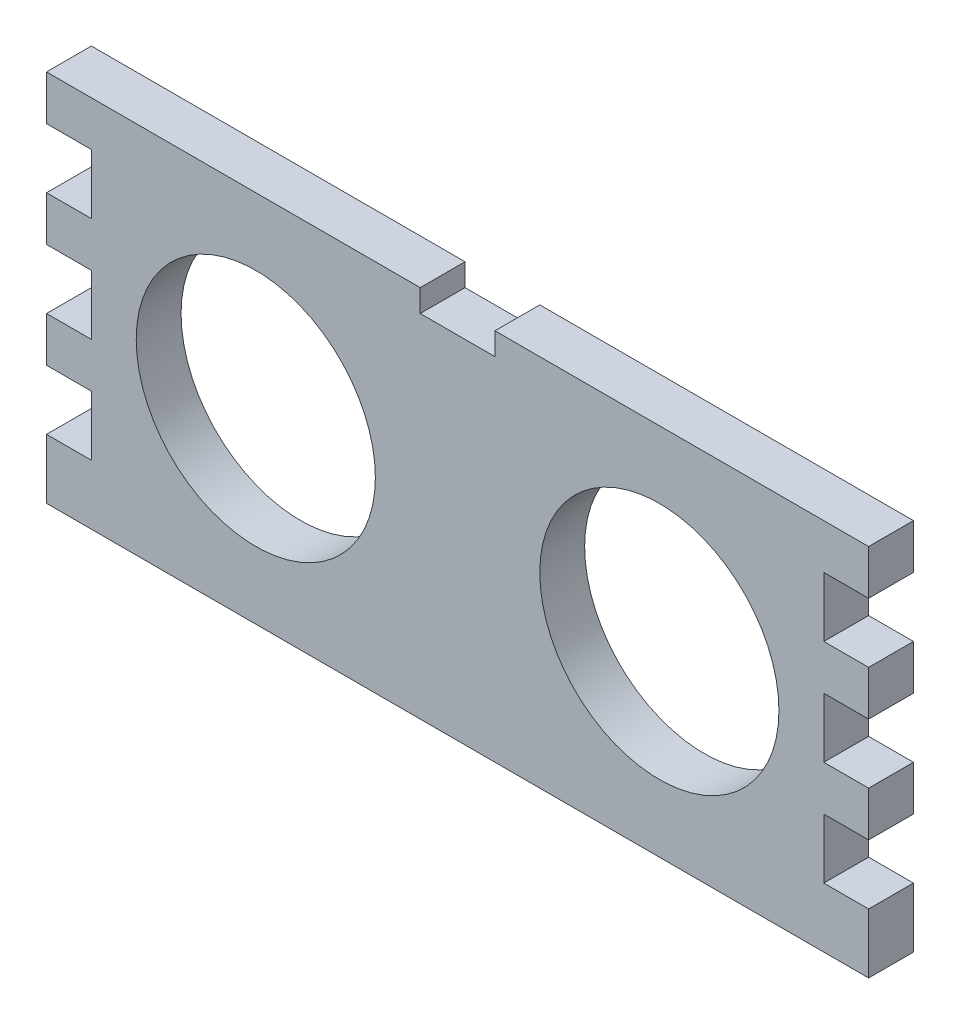
ISO-10303-21;
HEADER;
FILE_DESCRIPTION(('STEP AP214'),'2;1');
FILE_NAME('part.step','',(''),(''),'','','');
FILE_SCHEMA(('AUTOMOTIVE_DESIGN { 1 0 10303 214 1 1 1 1 }'));
ENDSEC;
DATA;
#1=APPLICATION_CONTEXT('core data for automotive mechanical design processes');
#2=APPLICATION_PROTOCOL_DEFINITION('international standard','automotive_design',2000,#1);
#3=PRODUCT_CONTEXT('',#1,'mechanical');
#4=PRODUCT('Part','Part','',(#3));
#5=PRODUCT_RELATED_PRODUCT_CATEGORY('part','',(#4));
#6=PRODUCT_DEFINITION_FORMATION('','',#4);
#7=PRODUCT_DEFINITION_CONTEXT('part definition',#1,'design');
#8=PRODUCT_DEFINITION('design','',#6,#7);
#9=PRODUCT_DEFINITION_SHAPE('','',#8);
#10=(LENGTH_UNIT() NAMED_UNIT(*) SI_UNIT(.MILLI.,.METRE.));
#11=(NAMED_UNIT(*) PLANE_ANGLE_UNIT() SI_UNIT($,.RADIAN.));
#12=(NAMED_UNIT(*) SI_UNIT($,.STERADIAN.) SOLID_ANGLE_UNIT());
#13=UNCERTAINTY_MEASURE_WITH_UNIT(LENGTH_MEASURE(1.E-05),#10,'distance_accuracy_value','');
#14=(GEOMETRIC_REPRESENTATION_CONTEXT(3) GLOBAL_UNCERTAINTY_ASSIGNED_CONTEXT((#13)) GLOBAL_UNIT_ASSIGNED_CONTEXT((#10,
#11,#12)) REPRESENTATION_CONTEXT('',''));
#15=CARTESIAN_POINT('',(0.,0.,0.));
#16=DIRECTION('',(0.,0.,1.));
#17=DIRECTION('',(1.,0.,0.));
#18=AXIS2_PLACEMENT_3D('',#15,#16,#17);
#19=CARTESIAN_POINT('',(-27.5,12.5,3.));
#20=DIRECTION('',(0.,-1.,0.));
#21=DIRECTION('',(0.,0.,-1.));
#22=AXIS2_PLACEMENT_3D('',#19,#20,#21);
#23=PLANE('',#22);
#24=DIRECTION('',(-1.,0.,0.));
#25=VECTOR('',#24,1.);
#26=CARTESIAN_POINT('',(-27.5,12.5,3.));
#27=LINE('',#26,#25);
#28=CARTESIAN_POINT('',(-2.5,12.5,3.));
#29=VERTEX_POINT('',#28);
#30=CARTESIAN_POINT('',(-27.5,12.5,3.));
#31=VERTEX_POINT('',#30);
#32=EDGE_CURVE('E444',#29,#31,#27,.T.);
#33=ORIENTED_EDGE('',*,*,#32,.F.);
#34=DIRECTION('',(0.,0.,1.));
#35=VECTOR('',#34,1.);
#36=CARTESIAN_POINT('',(-2.5,12.5,-7.));
#37=LINE('',#36,#35);
#38=CARTESIAN_POINT('',(-2.5,12.5,0.));
#39=VERTEX_POINT('',#38);
#40=EDGE_CURVE('E260',#39,#29,#37,.T.);
#41=ORIENTED_EDGE('',*,*,#40,.F.);
#42=DIRECTION('',(-1.,0.,0.));
#43=VECTOR('',#42,1.);
#44=CARTESIAN_POINT('',(-27.5,12.5,0.));
#45=LINE('',#44,#43);
#46=CARTESIAN_POINT('',(-27.5,12.5,0.));
#47=VERTEX_POINT('',#46);
#48=EDGE_CURVE('E460',#39,#47,#45,.T.);
#49=ORIENTED_EDGE('',*,*,#48,.T.);
#50=DIRECTION('',(0.,0.,-1.));
#51=VECTOR('',#50,1.);
#52=CARTESIAN_POINT('',(-27.5,12.5,3.));
#53=LINE('',#52,#51);
#54=EDGE_CURVE('E477',#31,#47,#53,.T.);
#55=ORIENTED_EDGE('',*,*,#54,.F.);
#56=EDGE_LOOP('',(#33,#41,#49,#55));
#57=FACE_BOUND('',#56,.T.);
#58=ADVANCED_FACE('F38',(#57),#23,.F.);
#59=CARTESIAN_POINT('',(27.5,-12.5,3.));
#60=DIRECTION('',(-1.,0.,0.));
#61=DIRECTION('',(0.,0.,1.));
#62=AXIS2_PLACEMENT_3D('',#59,#60,#61);
#63=PLANE('',#62);
#64=DIRECTION('',(0.,1.,0.));
#65=VECTOR('',#64,1.);
#66=CARTESIAN_POINT('',(27.5,-12.5,0.));
#67=LINE('',#66,#65);
#68=CARTESIAN_POINT('',(27.5,2.5,0.));
#69=VERTEX_POINT('',#68);
#70=CARTESIAN_POINT('',(27.5,5.5,0.));
#71=VERTEX_POINT('',#70);
#72=EDGE_CURVE('E572',#69,#71,#67,.T.);
#73=ORIENTED_EDGE('',*,*,#72,.T.);
#74=DIRECTION('',(0.,0.,1.));
#75=VECTOR('',#74,1.);
#76=CARTESIAN_POINT('',(27.5,5.5,0.));
#77=LINE('',#76,#75);
#78=CARTESIAN_POINT('',(27.5,5.5,3.));
#79=VERTEX_POINT('',#78);
#80=EDGE_CURVE('E292',#71,#79,#77,.T.);
#81=ORIENTED_EDGE('',*,*,#80,.T.);
#82=DIRECTION('',(0.,1.,0.));
#83=VECTOR('',#82,1.);
#84=CARTESIAN_POINT('',(27.5,-12.5,3.));
#85=LINE('',#84,#83);
#86=CARTESIAN_POINT('',(27.5,2.5,3.));
#87=VERTEX_POINT('',#86);
#88=EDGE_CURVE('E557',#87,#79,#85,.T.);
#89=ORIENTED_EDGE('',*,*,#88,.F.);
#90=DIRECTION('',(0.,0.,1.));
#91=VECTOR('',#90,1.);
#92=CARTESIAN_POINT('',(27.5,2.5,0.));
#93=LINE('',#92,#91);
#94=EDGE_CURVE('E301',#69,#87,#93,.T.);
#95=ORIENTED_EDGE('',*,*,#94,.F.);
#96=EDGE_LOOP('',(#73,#81,#89,#95));
#97=FACE_BOUND('',#96,.T.);
#98=ADVANCED_FACE('F586',(#97),#63,.F.);
#99=CARTESIAN_POINT('',(27.5,-4.5,0.));
#100=VERTEX_POINT('',#99);
#101=CARTESIAN_POINT('',(27.5,-1.5,0.));
#102=VERTEX_POINT('',#101);
#103=EDGE_CURVE('E461',#100,#102,#67,.T.);
#104=ORIENTED_EDGE('',*,*,#103,.T.);
#105=DIRECTION('',(0.,0.,1.));
#106=VECTOR('',#105,1.);
#107=CARTESIAN_POINT('',(27.5,-1.5,0.));
#108=LINE('',#107,#106);
#109=CARTESIAN_POINT('',(27.5,-1.5,3.));
#110=VERTEX_POINT('',#109);
#111=EDGE_CURVE('E308',#102,#110,#108,.T.);
#112=ORIENTED_EDGE('',*,*,#111,.T.);
#113=CARTESIAN_POINT('',(27.5,-4.5,3.));
#114=VERTEX_POINT('',#113);
#115=EDGE_CURVE('E445',#114,#110,#85,.T.);
#116=ORIENTED_EDGE('',*,*,#115,.F.);
#117=DIRECTION('',(0.,0.,1.));
#118=VECTOR('',#117,1.);
#119=CARTESIAN_POINT('',(27.5,-4.5,0.));
#120=LINE('',#119,#118);
#121=EDGE_CURVE('E327',#100,#114,#120,.T.);
#122=ORIENTED_EDGE('',*,*,#121,.F.);
#123=EDGE_LOOP('',(#104,#112,#116,#122));
#124=FACE_BOUND('',#123,.T.);
#125=ADVANCED_FACE('F555',(#124),#63,.F.);
#126=CARTESIAN_POINT('',(27.5,-12.5,0.));
#127=VERTEX_POINT('',#126);
#128=CARTESIAN_POINT('',(27.5,-8.5,0.));
#129=VERTEX_POINT('',#128);
#130=EDGE_CURVE('E457',#127,#129,#67,.T.);
#131=ORIENTED_EDGE('',*,*,#130,.T.);
#132=DIRECTION('',(0.,0.,1.));
#133=VECTOR('',#132,1.);
#134=CARTESIAN_POINT('',(27.5,-8.5,0.));
#135=LINE('',#134,#133);
#136=CARTESIAN_POINT('',(27.5,-8.5,3.));
#137=VERTEX_POINT('',#136);
#138=EDGE_CURVE('E270',#129,#137,#135,.T.);
#139=ORIENTED_EDGE('',*,*,#138,.T.);
#140=CARTESIAN_POINT('',(27.5,-12.5,3.));
#141=VERTEX_POINT('',#140);
#142=EDGE_CURVE('E441',#141,#137,#85,.T.);
#143=ORIENTED_EDGE('',*,*,#142,.F.);
#144=DIRECTION('',(0.,0.,-1.));
#145=VECTOR('',#144,1.);
#146=CARTESIAN_POINT('',(27.5,-12.5,3.));
#147=LINE('',#146,#145);
#148=EDGE_CURVE('E456',#141,#127,#147,.T.);
#149=ORIENTED_EDGE('',*,*,#148,.T.);
#150=EDGE_LOOP('',(#131,#139,#143,#149));
#151=FACE_BOUND('',#150,.T.);
#152=ADVANCED_FACE('F537',(#151),#63,.F.);
#153=CARTESIAN_POINT('',(-27.5,-12.5,3.));
#154=DIRECTION('',(1.,0.,0.));
#155=DIRECTION('',(0.,0.,-1.));
#156=AXIS2_PLACEMENT_3D('',#153,#154,#155);
#157=PLANE('',#156);
#158=DIRECTION('',(0.,-1.,0.));
#159=VECTOR('',#158,1.);
#160=CARTESIAN_POINT('',(-27.5,-12.5,0.));
#161=LINE('',#160,#159);
#162=CARTESIAN_POINT('',(-27.5,9.5,0.));
#163=VERTEX_POINT('',#162);
#164=EDGE_CURVE('E466',#47,#163,#161,.T.);
#165=ORIENTED_EDGE('',*,*,#164,.T.);
#166=DIRECTION('',(0.,0.,1.));
#167=VECTOR('',#166,1.);
#168=CARTESIAN_POINT('',(-27.5,9.5,0.));
#169=LINE('',#168,#167);
#170=CARTESIAN_POINT('',(-27.5,9.5,3.));
#171=VERTEX_POINT('',#170);
#172=EDGE_CURVE('E370',#163,#171,#169,.T.);
#173=ORIENTED_EDGE('',*,*,#172,.T.);
#174=DIRECTION('',(0.,-1.,0.));
#175=VECTOR('',#174,1.);
#176=CARTESIAN_POINT('',(-27.5,-12.5,3.));
#177=LINE('',#176,#175);
#178=EDGE_CURVE('E450',#31,#171,#177,.T.);
#179=ORIENTED_EDGE('',*,*,#178,.F.);
#180=ORIENTED_EDGE('',*,*,#54,.T.);
#181=EDGE_LOOP('',(#165,#173,#179,#180));
#182=FACE_BOUND('',#181,.T.);
#183=ADVANCED_FACE('F498',(#182),#157,.F.);
#184=CARTESIAN_POINT('',(-27.5,5.5,3.));
#185=VERTEX_POINT('',#184);
#186=CARTESIAN_POINT('',(-27.5,2.5,3.));
#187=VERTEX_POINT('',#186);
#188=EDGE_CURVE('E454',#185,#187,#177,.T.);
#189=ORIENTED_EDGE('',*,*,#188,.F.);
#190=DIRECTION('',(0.,0.,1.));
#191=VECTOR('',#190,1.);
#192=CARTESIAN_POINT('',(-27.5,5.5,0.));
#193=LINE('',#192,#191);
#194=CARTESIAN_POINT('',(-27.5,5.5,0.));
#195=VERTEX_POINT('',#194);
#196=EDGE_CURVE('E361',#195,#185,#193,.T.);
#197=ORIENTED_EDGE('',*,*,#196,.F.);
#198=CARTESIAN_POINT('',(-27.5,2.5,0.));
#199=VERTEX_POINT('',#198);
#200=EDGE_CURVE('E470',#195,#199,#161,.T.);
#201=ORIENTED_EDGE('',*,*,#200,.T.);
#202=DIRECTION('',(0.,0.,1.));
#203=VECTOR('',#202,1.);
#204=CARTESIAN_POINT('',(-27.5,2.5,0.));
#205=LINE('',#204,#203);
#206=EDGE_CURVE('E386',#199,#187,#205,.T.);
#207=ORIENTED_EDGE('',*,*,#206,.T.);
#208=EDGE_LOOP('',(#189,#197,#201,#207));
#209=FACE_BOUND('',#208,.T.);
#210=ADVANCED_FACE('F514',(#209),#157,.F.);
#211=CARTESIAN_POINT('',(-27.5,-1.5,3.));
#212=VERTEX_POINT('',#211);
#213=CARTESIAN_POINT('',(-27.5,-4.5,3.));
#214=VERTEX_POINT('',#213);
#215=EDGE_CURVE('E516',#212,#214,#177,.T.);
#216=ORIENTED_EDGE('',*,*,#215,.F.);
#217=DIRECTION('',(0.,0.,1.));
#218=VECTOR('',#217,1.);
#219=CARTESIAN_POINT('',(-27.5,-1.5,0.));
#220=LINE('',#219,#218);
#221=CARTESIAN_POINT('',(-27.5,-1.5,0.));
#222=VERTEX_POINT('',#221);
#223=EDGE_CURVE('E379',#222,#212,#220,.T.);
#224=ORIENTED_EDGE('',*,*,#223,.F.);
#225=CARTESIAN_POINT('',(-27.5,-4.5,0.));
#226=VERTEX_POINT('',#225);
#227=EDGE_CURVE('E903',#222,#226,#161,.T.);
#228=ORIENTED_EDGE('',*,*,#227,.T.);
#229=DIRECTION('',(0.,0.,1.));
#230=VECTOR('',#229,1.);
#231=CARTESIAN_POINT('',(-27.5,-4.5,0.));
#232=LINE('',#231,#230);
#233=EDGE_CURVE('E295',#226,#214,#232,.T.);
#234=ORIENTED_EDGE('',*,*,#233,.T.);
#235=EDGE_LOOP('',(#216,#224,#228,#234));
#236=FACE_BOUND('',#235,.T.);
#237=ADVANCED_FACE('F612',(#236),#157,.F.);
#238=CARTESIAN_POINT('',(27.5,9.5,3.));
#239=VERTEX_POINT('',#238);
#240=CARTESIAN_POINT('',(27.5,12.5,3.));
#241=VERTEX_POINT('',#240);
#242=EDGE_CURVE('E446',#239,#241,#85,.T.);
#243=ORIENTED_EDGE('',*,*,#242,.F.);
#244=DIRECTION('',(0.,0.,1.));
#245=VECTOR('',#244,1.);
#246=CARTESIAN_POINT('',(27.5,9.5,0.));
#247=LINE('',#246,#245);
#248=CARTESIAN_POINT('',(27.5,9.5,0.));
#249=VERTEX_POINT('',#248);
#250=EDGE_CURVE('E283',#249,#239,#247,.T.);
#251=ORIENTED_EDGE('',*,*,#250,.F.);
#252=CARTESIAN_POINT('',(27.5,12.5,0.));
#253=VERTEX_POINT('',#252);
#254=EDGE_CURVE('E432',#249,#253,#67,.T.);
#255=ORIENTED_EDGE('',*,*,#254,.T.);
#256=DIRECTION('',(0.,0.,-1.));
#257=VECTOR('',#256,1.);
#258=CARTESIAN_POINT('',(27.5,12.5,3.));
#259=LINE('',#258,#257);
#260=EDGE_CURVE('E480',#241,#253,#259,.T.);
#261=ORIENTED_EDGE('',*,*,#260,.F.);
#262=EDGE_LOOP('',(#243,#251,#255,#261));
#263=FACE_BOUND('',#262,.T.);
#264=ADVANCED_FACE('F40',(#263),#63,.F.);
#265=CARTESIAN_POINT('',(2.5,12.5,0.));
#266=VERTEX_POINT('',#265);
#267=EDGE_CURVE('E462',#253,#266,#45,.T.);
#268=ORIENTED_EDGE('',*,*,#267,.T.);
#269=DIRECTION('',(0.,0.,1.));
#270=VECTOR('',#269,1.);
#271=CARTESIAN_POINT('',(2.5,12.5,-7.));
#272=LINE('',#271,#270);
#273=CARTESIAN_POINT('',(2.5,12.5,3.));
#274=VERTEX_POINT('',#273);
#275=EDGE_CURVE('E271',#266,#274,#272,.T.);
#276=ORIENTED_EDGE('',*,*,#275,.T.);
#277=EDGE_CURVE('E447',#241,#274,#27,.T.);
#278=ORIENTED_EDGE('',*,*,#277,.F.);
#279=ORIENTED_EDGE('',*,*,#260,.T.);
#280=EDGE_LOOP('',(#268,#276,#278,#279));
#281=FACE_BOUND('',#280,.T.);
#282=ADVANCED_FACE('F570',(#281),#23,.F.);
#283=CARTESIAN_POINT('',(-27.5,-8.5,3.));
#284=VERTEX_POINT('',#283);
#285=CARTESIAN_POINT('',(-27.5,-12.5,3.));
#286=VERTEX_POINT('',#285);
#287=EDGE_CURVE('E449',#284,#286,#177,.T.);
#288=ORIENTED_EDGE('',*,*,#287,.F.);
#289=DIRECTION('',(0.,0.,1.));
#290=VECTOR('',#289,1.);
#291=CARTESIAN_POINT('',(-27.5,-8.5,0.));
#292=LINE('',#291,#290);
#293=CARTESIAN_POINT('',(-27.5,-8.5,0.));
#294=VERTEX_POINT('',#293);
#295=EDGE_CURVE('E405',#294,#284,#292,.T.);
#296=ORIENTED_EDGE('',*,*,#295,.F.);
#297=CARTESIAN_POINT('',(-27.5,-12.5,0.));
#298=VERTEX_POINT('',#297);
#299=EDGE_CURVE('E465',#294,#298,#161,.T.);
#300=ORIENTED_EDGE('',*,*,#299,.T.);
#301=DIRECTION('',(0.,0.,-1.));
#302=VECTOR('',#301,1.);
#303=CARTESIAN_POINT('',(-27.5,-12.5,3.));
#304=LINE('',#303,#302);
#305=EDGE_CURVE('E474',#286,#298,#304,.T.);
#306=ORIENTED_EDGE('',*,*,#305,.F.);
#307=EDGE_LOOP('',(#288,#296,#300,#306));
#308=FACE_BOUND('',#307,.T.);
#309=ADVANCED_FACE('F529',(#308),#157,.F.);
#310=CARTESIAN_POINT('',(-27.5,-12.5,3.));
#311=DIRECTION('',(0.,1.,0.));
#312=DIRECTION('',(0.,0.,1.));
#313=AXIS2_PLACEMENT_3D('',#310,#311,#312);
#314=PLANE('',#313);
#315=DIRECTION('',(1.,0.,0.));
#316=VECTOR('',#315,1.);
#317=CARTESIAN_POINT('',(-27.5,-12.5,0.));
#318=LINE('',#317,#316);
#319=EDGE_CURVE('E469',#298,#127,#318,.T.);
#320=ORIENTED_EDGE('',*,*,#319,.T.);
#321=ORIENTED_EDGE('',*,*,#148,.F.);
#322=DIRECTION('',(1.,0.,0.));
#323=VECTOR('',#322,1.);
#324=CARTESIAN_POINT('',(-27.5,-12.5,3.));
#325=LINE('',#324,#323);
#326=EDGE_CURVE('E453',#286,#141,#325,.T.);
#327=ORIENTED_EDGE('',*,*,#326,.F.);
#328=ORIENTED_EDGE('',*,*,#305,.T.);
#329=EDGE_LOOP('',(#320,#321,#327,#328));
#330=FACE_BOUND('',#329,.T.);
#331=ADVANCED_FACE('F533',(#330),#314,.F.);
#332=CARTESIAN_POINT('',(0.,0.,3.));
#333=DIRECTION('',(0.,0.,-1.));
#334=DIRECTION('',(-1.,0.,0.));
#335=AXIS2_PLACEMENT_3D('',#332,#333,#334);
#336=PLANE('',#335);
#337=CARTESIAN_POINT('',(-13.5,0.,3.));
#338=DIRECTION('',(0.,0.,1.));
#339=DIRECTION('',(1.,0.,0.));
#340=AXIS2_PLACEMENT_3D('',#337,#338,#339);
#341=CIRCLE('',#340,8.);
#342=CARTESIAN_POINT('',(-5.5,0.,3.));
#343=VERTEX_POINT('',#342);
#344=EDGE_CURVE('E433',#343,#343,#341,.T.);
#345=ORIENTED_EDGE('',*,*,#344,.F.);
#346=EDGE_LOOP('',(#345));
#347=FACE_BOUND('',#346,.T.);
#348=CARTESIAN_POINT('',(13.5,0.,3.));
#349=DIRECTION('',(0.,0.,1.));
#350=DIRECTION('',(1.,0.,0.));
#351=AXIS2_PLACEMENT_3D('',#348,#349,#350);
#352=CIRCLE('',#351,8.);
#353=CARTESIAN_POINT('',(21.5,0.,3.));
#354=VERTEX_POINT('',#353);
#355=EDGE_CURVE('E436',#354,#354,#352,.T.);
#356=ORIENTED_EDGE('',*,*,#355,.F.);
#357=EDGE_LOOP('',(#356));
#358=FACE_BOUND('',#357,.T.);
#359=DIRECTION('',(1.,0.,0.));
#360=VECTOR('',#359,1.);
#361=CARTESIAN_POINT('',(-2.5,11.,3.));
#362=LINE('',#361,#360);
#363=CARTESIAN_POINT('',(-2.5,11.,3.));
#364=VERTEX_POINT('',#363);
#365=CARTESIAN_POINT('',(2.5,11.,3.));
#366=VERTEX_POINT('',#365);
#367=EDGE_CURVE('E248',#364,#366,#362,.T.);
#368=ORIENTED_EDGE('',*,*,#367,.F.);
#369=DIRECTION('',(0.,-1.,0.));
#370=VECTOR('',#369,1.);
#371=CARTESIAN_POINT('',(-2.5,12.5,3.));
#372=LINE('',#371,#370);
#373=EDGE_CURVE('E257',#29,#364,#372,.T.);
#374=ORIENTED_EDGE('',*,*,#373,.F.);
#375=ORIENTED_EDGE('',*,*,#32,.T.);
#376=ORIENTED_EDGE('',*,*,#178,.T.);
#377=DIRECTION('',(-1.,0.,0.));
#378=VECTOR('',#377,1.);
#379=CARTESIAN_POINT('',(-27.5,9.5,3.));
#380=LINE('',#379,#378);
#381=CARTESIAN_POINT('',(-24.5,9.5,3.));
#382=VERTEX_POINT('',#381);
#383=EDGE_CURVE('E355',#382,#171,#380,.T.);
#384=ORIENTED_EDGE('',*,*,#383,.F.);
#385=DIRECTION('',(0.,1.,0.));
#386=VECTOR('',#385,1.);
#387=CARTESIAN_POINT('',(-24.5,9.5,3.));
#388=LINE('',#387,#386);
#389=CARTESIAN_POINT('',(-24.5,5.5,3.));
#390=VERTEX_POINT('',#389);
#391=EDGE_CURVE('E365',#390,#382,#388,.T.);
#392=ORIENTED_EDGE('',*,*,#391,.F.);
#393=DIRECTION('',(1.,0.,0.));
#394=VECTOR('',#393,1.);
#395=CARTESIAN_POINT('',(-27.5,5.5,3.));
#396=LINE('',#395,#394);
#397=EDGE_CURVE('E362',#185,#390,#396,.T.);
#398=ORIENTED_EDGE('',*,*,#397,.F.);
#399=ORIENTED_EDGE('',*,*,#188,.T.);
#400=DIRECTION('',(-1.,0.,0.));
#401=VECTOR('',#400,1.);
#402=CARTESIAN_POINT('',(-27.5,2.5,3.));
#403=LINE('',#402,#401);
#404=CARTESIAN_POINT('',(-24.5,2.5,3.));
#405=VERTEX_POINT('',#404);
#406=EDGE_CURVE('E390',#405,#187,#403,.T.);
#407=ORIENTED_EDGE('',*,*,#406,.F.);
#408=DIRECTION('',(0.,1.,0.));
#409=VECTOR('',#408,1.);
#410=CARTESIAN_POINT('',(-24.5,2.5,3.));
#411=LINE('',#410,#409);
#412=CARTESIAN_POINT('',(-24.5,-1.5,3.));
#413=VERTEX_POINT('',#412);
#414=EDGE_CURVE('E392',#413,#405,#411,.T.);
#415=ORIENTED_EDGE('',*,*,#414,.F.);
#416=DIRECTION('',(1.,0.,0.));
#417=VECTOR('',#416,1.);
#418=CARTESIAN_POINT('',(-27.5,-1.5,3.));
#419=LINE('',#418,#417);
#420=EDGE_CURVE('E366',#212,#413,#419,.T.);
#421=ORIENTED_EDGE('',*,*,#420,.F.);
#422=ORIENTED_EDGE('',*,*,#215,.T.);
#423=DIRECTION('',(-1.,0.,0.));
#424=VECTOR('',#423,1.);
#425=CARTESIAN_POINT('',(-27.5,-4.5,3.));
#426=LINE('',#425,#424);
#427=CARTESIAN_POINT('',(-24.5,-4.5,3.));
#428=VERTEX_POINT('',#427);
#429=EDGE_CURVE('E414',#428,#214,#426,.T.);
#430=ORIENTED_EDGE('',*,*,#429,.F.);
#431=DIRECTION('',(0.,1.,0.));
#432=VECTOR('',#431,1.);
#433=CARTESIAN_POINT('',(-24.5,-4.5,3.));
#434=LINE('',#433,#432);
#435=CARTESIAN_POINT('',(-24.5,-8.5,3.));
#436=VERTEX_POINT('',#435);
#437=EDGE_CURVE('E416',#436,#428,#434,.T.);
#438=ORIENTED_EDGE('',*,*,#437,.F.);
#439=DIRECTION('',(1.,0.,0.));
#440=VECTOR('',#439,1.);
#441=CARTESIAN_POINT('',(-27.5,-8.5,3.));
#442=LINE('',#441,#440);
#443=EDGE_CURVE('E389',#284,#436,#442,.T.);
#444=ORIENTED_EDGE('',*,*,#443,.F.);
#445=ORIENTED_EDGE('',*,*,#287,.T.);
#446=ORIENTED_EDGE('',*,*,#326,.T.);
#447=ORIENTED_EDGE('',*,*,#142,.T.);
#448=DIRECTION('',(1.,0.,0.));
#449=VECTOR('',#448,1.);
#450=CARTESIAN_POINT('',(27.5,-8.5,3.));
#451=LINE('',#450,#449);
#452=CARTESIAN_POINT('',(24.5,-8.5,3.));
#453=VERTEX_POINT('',#452);
#454=EDGE_CURVE('E336',#453,#137,#451,.T.);
#455=ORIENTED_EDGE('',*,*,#454,.F.);
#456=DIRECTION('',(0.,-1.,0.));
#457=VECTOR('',#456,1.);
#458=CARTESIAN_POINT('',(24.5,-4.5,3.));
#459=LINE('',#458,#457);
#460=CARTESIAN_POINT('',(24.5,-4.5,3.));
#461=VERTEX_POINT('',#460);
#462=EDGE_CURVE('E338',#461,#453,#459,.T.);
#463=ORIENTED_EDGE('',*,*,#462,.F.);
#464=DIRECTION('',(-1.,0.,0.));
#465=VECTOR('',#464,1.);
#466=CARTESIAN_POINT('',(27.5,-4.5,3.));
#467=LINE('',#466,#465);
#468=EDGE_CURVE('E311',#114,#461,#467,.T.);
#469=ORIENTED_EDGE('',*,*,#468,.F.);
#470=ORIENTED_EDGE('',*,*,#115,.T.);
#471=DIRECTION('',(1.,0.,0.));
#472=VECTOR('',#471,1.);
#473=CARTESIAN_POINT('',(27.5,-1.5,3.));
#474=LINE('',#473,#472);
#475=CARTESIAN_POINT('',(24.5,-1.5,3.));
#476=VERTEX_POINT('',#475);
#477=EDGE_CURVE('E312',#476,#110,#474,.T.);
#478=ORIENTED_EDGE('',*,*,#477,.F.);
#479=DIRECTION('',(0.,-1.,0.));
#480=VECTOR('',#479,1.);
#481=CARTESIAN_POINT('',(24.5,2.5,3.));
#482=LINE('',#481,#480);
#483=CARTESIAN_POINT('',(24.5,2.5,3.));
#484=VERTEX_POINT('',#483);
#485=EDGE_CURVE('E314',#484,#476,#482,.T.);
#486=ORIENTED_EDGE('',*,*,#485,.F.);
#487=DIRECTION('',(-1.,0.,0.));
#488=VECTOR('',#487,1.);
#489=CARTESIAN_POINT('',(27.5,2.5,3.));
#490=LINE('',#489,#488);
#491=EDGE_CURVE('E288',#87,#484,#490,.T.);
#492=ORIENTED_EDGE('',*,*,#491,.F.);
#493=ORIENTED_EDGE('',*,*,#88,.T.);
#494=DIRECTION('',(1.,0.,0.));
#495=VECTOR('',#494,1.);
#496=CARTESIAN_POINT('',(27.5,5.5,3.));
#497=LINE('',#496,#495);
#498=CARTESIAN_POINT('',(24.5,5.5,3.));
#499=VERTEX_POINT('',#498);
#500=EDGE_CURVE('E278',#499,#79,#497,.T.);
#501=ORIENTED_EDGE('',*,*,#500,.F.);
#502=DIRECTION('',(0.,-1.,0.));
#503=VECTOR('',#502,1.);
#504=CARTESIAN_POINT('',(24.5,9.5,3.));
#505=LINE('',#504,#503);
#506=CARTESIAN_POINT('',(24.5,9.5,3.));
#507=VERTEX_POINT('',#506);
#508=EDGE_CURVE('E287',#507,#499,#505,.T.);
#509=ORIENTED_EDGE('',*,*,#508,.F.);
#510=DIRECTION('',(-1.,0.,0.));
#511=VECTOR('',#510,1.);
#512=CARTESIAN_POINT('',(27.5,9.5,3.));
#513=LINE('',#512,#511);
#514=EDGE_CURVE('E284',#239,#507,#513,.T.);
#515=ORIENTED_EDGE('',*,*,#514,.F.);
#516=ORIENTED_EDGE('',*,*,#242,.T.);
#517=ORIENTED_EDGE('',*,*,#277,.T.);
#518=DIRECTION('',(0.,1.,0.));
#519=VECTOR('',#518,1.);
#520=CARTESIAN_POINT('',(2.5,12.5,3.));
#521=LINE('',#520,#519);
#522=EDGE_CURVE('E254',#366,#274,#521,.T.);
#523=ORIENTED_EDGE('',*,*,#522,.F.);
#524=EDGE_LOOP('',(#368,#374,#375,#376,#384,#392,#398,#399,#407,#415,#421,#422,#430,#438,#444,
#445,#446,#447,#455,#463,#469,#470,#478,#486,#492,#493,#501,#509,#515,#516,#517,#523));
#525=FACE_BOUND('',#524,.T.);
#526=ADVANCED_FACE('F264',(#347,#358,#525),#336,.F.);
#527=CARTESIAN_POINT('',(0.,0.,0.));
#528=DIRECTION('',(0.,0.,-1.));
#529=DIRECTION('',(-1.,0.,0.));
#530=AXIS2_PLACEMENT_3D('',#527,#528,#529);
#531=PLANE('',#530);
#532=DIRECTION('',(0.,1.,0.));
#533=VECTOR('',#532,1.);
#534=CARTESIAN_POINT('',(-2.50000000000001,0.,0.));
#535=LINE('',#534,#533);
#536=CARTESIAN_POINT('',(-2.5,11.,0.));
#537=VERTEX_POINT('',#536);
#538=EDGE_CURVE('E11',#537,#39,#535,.T.);
#539=ORIENTED_EDGE('',*,*,#538,.F.);
#540=DIRECTION('',(-1.,0.,0.));
#541=VECTOR('',#540,1.);
#542=CARTESIAN_POINT('',(0.,11.,0.));
#543=LINE('',#542,#541);
#544=CARTESIAN_POINT('',(2.5,11.,0.));
#545=VERTEX_POINT('',#544);
#546=EDGE_CURVE('E251',#545,#537,#543,.T.);
#547=ORIENTED_EDGE('',*,*,#546,.F.);
#548=DIRECTION('',(0.,-1.,0.));
#549=VECTOR('',#548,1.);
#550=CARTESIAN_POINT('',(2.5,0.,0.));
#551=LINE('',#550,#549);
#552=EDGE_CURVE('E46',#266,#545,#551,.T.);
#553=ORIENTED_EDGE('',*,*,#552,.F.);
#554=ORIENTED_EDGE('',*,*,#267,.F.);
#555=ORIENTED_EDGE('',*,*,#254,.F.);
#556=DIRECTION('',(-1.,0.,0.));
#557=VECTOR('',#556,1.);
#558=CARTESIAN_POINT('',(27.5,9.5,0.));
#559=LINE('',#558,#557);
#560=CARTESIAN_POINT('',(24.5,9.5,0.));
#561=VERTEX_POINT('',#560);
#562=EDGE_CURVE('E275',#249,#561,#559,.T.);
#563=ORIENTED_EDGE('',*,*,#562,.T.);
#564=DIRECTION('',(0.,-1.,0.));
#565=VECTOR('',#564,1.);
#566=CARTESIAN_POINT('',(24.5,9.5,0.));
#567=LINE('',#566,#565);
#568=CARTESIAN_POINT('',(24.5,5.5,0.));
#569=VERTEX_POINT('',#568);
#570=EDGE_CURVE('E61',#561,#569,#567,.T.);
#571=ORIENTED_EDGE('',*,*,#570,.T.);
#572=DIRECTION('',(1.,0.,0.));
#573=VECTOR('',#572,1.);
#574=CARTESIAN_POINT('',(27.5,5.5,0.));
#575=LINE('',#574,#573);
#576=EDGE_CURVE('E280',#569,#71,#575,.T.);
#577=ORIENTED_EDGE('',*,*,#576,.T.);
#578=ORIENTED_EDGE('',*,*,#72,.F.);
#579=DIRECTION('',(-1.,0.,0.));
#580=VECTOR('',#579,1.);
#581=CARTESIAN_POINT('',(27.5,2.5,0.));
#582=LINE('',#581,#580);
#583=CARTESIAN_POINT('',(24.5,2.5,0.));
#584=VERTEX_POINT('',#583);
#585=EDGE_CURVE('E315',#69,#584,#582,.T.);
#586=ORIENTED_EDGE('',*,*,#585,.T.);
#587=DIRECTION('',(0.,-1.,0.));
#588=VECTOR('',#587,1.);
#589=CARTESIAN_POINT('',(24.5,2.5,0.));
#590=LINE('',#589,#588);
#591=CARTESIAN_POINT('',(24.5,-1.5,0.));
#592=VERTEX_POINT('',#591);
#593=EDGE_CURVE('E322',#584,#592,#590,.T.);
#594=ORIENTED_EDGE('',*,*,#593,.T.);
#595=DIRECTION('',(1.,0.,0.));
#596=VECTOR('',#595,1.);
#597=CARTESIAN_POINT('',(27.5,-1.5,0.));
#598=LINE('',#597,#596);
#599=EDGE_CURVE('E303',#592,#102,#598,.T.);
#600=ORIENTED_EDGE('',*,*,#599,.T.);
#601=ORIENTED_EDGE('',*,*,#103,.F.);
#602=DIRECTION('',(-1.,0.,0.));
#603=VECTOR('',#602,1.);
#604=CARTESIAN_POINT('',(27.5,-4.5,0.));
#605=LINE('',#604,#603);
#606=CARTESIAN_POINT('',(24.5,-4.5,0.));
#607=VERTEX_POINT('',#606);
#608=EDGE_CURVE('E339',#100,#607,#605,.T.);
#609=ORIENTED_EDGE('',*,*,#608,.T.);
#610=DIRECTION('',(0.,-1.,0.));
#611=VECTOR('',#610,1.);
#612=CARTESIAN_POINT('',(24.5,-4.5,0.));
#613=LINE('',#612,#611);
#614=CARTESIAN_POINT('',(24.5,-8.5,0.));
#615=VERTEX_POINT('',#614);
#616=EDGE_CURVE('E346',#607,#615,#613,.T.);
#617=ORIENTED_EDGE('',*,*,#616,.T.);
#618=DIRECTION('',(1.,0.,0.));
#619=VECTOR('',#618,1.);
#620=CARTESIAN_POINT('',(27.5,-8.5,0.));
#621=LINE('',#620,#619);
#622=EDGE_CURVE('E329',#615,#129,#621,.T.);
#623=ORIENTED_EDGE('',*,*,#622,.T.);
#624=ORIENTED_EDGE('',*,*,#130,.F.);
#625=ORIENTED_EDGE('',*,*,#319,.F.);
#626=ORIENTED_EDGE('',*,*,#299,.F.);
#627=DIRECTION('',(1.,0.,0.));
#628=VECTOR('',#627,1.);
#629=CARTESIAN_POINT('',(-27.5,-8.5,0.));
#630=LINE('',#629,#628);
#631=CARTESIAN_POINT('',(-24.5,-8.5,0.));
#632=VERTEX_POINT('',#631);
#633=EDGE_CURVE('E417',#294,#632,#630,.T.);
#634=ORIENTED_EDGE('',*,*,#633,.T.);
#635=DIRECTION('',(0.,1.,0.));
#636=VECTOR('',#635,1.);
#637=CARTESIAN_POINT('',(-24.5,-4.5,0.));
#638=LINE('',#637,#636);
#639=CARTESIAN_POINT('',(-24.5,-4.5,0.));
#640=VERTEX_POINT('',#639);
#641=EDGE_CURVE('E424',#632,#640,#638,.T.);
#642=ORIENTED_EDGE('',*,*,#641,.T.);
#643=DIRECTION('',(-1.,0.,0.));
#644=VECTOR('',#643,1.);
#645=CARTESIAN_POINT('',(-27.5,-4.5,0.));
#646=LINE('',#645,#644);
#647=EDGE_CURVE('E407',#640,#226,#646,.T.);
#648=ORIENTED_EDGE('',*,*,#647,.T.);
#649=ORIENTED_EDGE('',*,*,#227,.F.);
#650=DIRECTION('',(1.,0.,0.));
#651=VECTOR('',#650,1.);
#652=CARTESIAN_POINT('',(-27.5,-1.5,0.));
#653=LINE('',#652,#651);
#654=CARTESIAN_POINT('',(-24.5,-1.5,0.));
#655=VERTEX_POINT('',#654);
#656=EDGE_CURVE('E393',#222,#655,#653,.T.);
#657=ORIENTED_EDGE('',*,*,#656,.T.);
#658=DIRECTION('',(0.,1.,0.));
#659=VECTOR('',#658,1.);
#660=CARTESIAN_POINT('',(-24.5,2.5,0.));
#661=LINE('',#660,#659);
#662=CARTESIAN_POINT('',(-24.5,2.5,0.));
#663=VERTEX_POINT('',#662);
#664=EDGE_CURVE('E400',#655,#663,#661,.T.);
#665=ORIENTED_EDGE('',*,*,#664,.T.);
#666=DIRECTION('',(-1.,0.,0.));
#667=VECTOR('',#666,1.);
#668=CARTESIAN_POINT('',(-27.5,2.5,0.));
#669=LINE('',#668,#667);
#670=EDGE_CURVE('E381',#663,#199,#669,.T.);
#671=ORIENTED_EDGE('',*,*,#670,.T.);
#672=ORIENTED_EDGE('',*,*,#200,.F.);
#673=DIRECTION('',(1.,0.,0.));
#674=VECTOR('',#673,1.);
#675=CARTESIAN_POINT('',(-27.5,5.5,0.));
#676=LINE('',#675,#674);
#677=CARTESIAN_POINT('',(-24.5,5.5,0.));
#678=VERTEX_POINT('',#677);
#679=EDGE_CURVE('E351',#195,#678,#676,.T.);
#680=ORIENTED_EDGE('',*,*,#679,.T.);
#681=DIRECTION('',(0.,1.,0.));
#682=VECTOR('',#681,1.);
#683=CARTESIAN_POINT('',(-24.5,9.5,0.));
#684=LINE('',#683,#682);
#685=CARTESIAN_POINT('',(-24.5,9.5,0.));
#686=VERTEX_POINT('',#685);
#687=EDGE_CURVE('E354',#678,#686,#684,.T.);
#688=ORIENTED_EDGE('',*,*,#687,.T.);
#689=DIRECTION('',(-1.,0.,0.));
#690=VECTOR('',#689,1.);
#691=CARTESIAN_POINT('',(-27.5,9.5,0.));
#692=LINE('',#691,#690);
#693=EDGE_CURVE('E358',#686,#163,#692,.T.);
#694=ORIENTED_EDGE('',*,*,#693,.T.);
#695=ORIENTED_EDGE('',*,*,#164,.F.);
#696=ORIENTED_EDGE('',*,*,#48,.F.);
#697=EDGE_LOOP('',(#539,#547,#553,#554,#555,#563,#571,#577,#578,#586,#594,#600,#601,#609,#617,
#623,#624,#625,#626,#634,#642,#648,#649,#657,#665,#671,#672,#680,#688,#694,#695,#696));
#698=FACE_BOUND('',#697,.T.);
#699=CARTESIAN_POINT('',(-13.5,0.,0.));
#700=DIRECTION('',(0.,0.,1.));
#701=DIRECTION('',(1.,0.,0.));
#702=AXIS2_PLACEMENT_3D('',#699,#700,#701);
#703=CIRCLE('',#702,8.);
#704=CARTESIAN_POINT('',(-5.5,0.,0.));
#705=VERTEX_POINT('',#704);
#706=EDGE_CURVE('E429',#705,#705,#703,.T.);
#707=ORIENTED_EDGE('',*,*,#706,.T.);
#708=EDGE_LOOP('',(#707));
#709=FACE_BOUND('',#708,.T.);
#710=CARTESIAN_POINT('',(13.5,0.,0.));
#711=DIRECTION('',(0.,0.,1.));
#712=DIRECTION('',(1.,0.,0.));
#713=AXIS2_PLACEMENT_3D('',#710,#711,#712);
#714=CIRCLE('',#713,8.);
#715=CARTESIAN_POINT('',(21.5,0.,0.));
#716=VERTEX_POINT('',#715);
#717=EDGE_CURVE('E373',#716,#716,#714,.T.);
#718=ORIENTED_EDGE('',*,*,#717,.T.);
#719=EDGE_LOOP('',(#718));
#720=FACE_BOUND('',#719,.T.);
#721=ADVANCED_FACE('F488',(#698,#709,#720),#531,.T.);
#722=CARTESIAN_POINT('',(13.5,0.,0.));
#723=DIRECTION('',(0.,0.,1.));
#724=DIRECTION('',(1.,0.,0.));
#725=AXIS2_PLACEMENT_3D('',#722,#723,#724);
#726=CYLINDRICAL_SURFACE('',#725,8.);
#727=ORIENTED_EDGE('',*,*,#717,.F.);
#728=EDGE_LOOP('',(#727));
#729=FACE_BOUND('',#728,.T.);
#730=ORIENTED_EDGE('',*,*,#355,.T.);
#731=EDGE_LOOP('',(#730));
#732=FACE_BOUND('',#731,.T.);
#733=ADVANCED_FACE('F735',(#729,#732),#726,.F.);
#734=CARTESIAN_POINT('',(-13.5,0.,0.));
#735=DIRECTION('',(0.,0.,1.));
#736=DIRECTION('',(1.,0.,0.));
#737=AXIS2_PLACEMENT_3D('',#734,#735,#736);
#738=CYLINDRICAL_SURFACE('',#737,8.);
#739=ORIENTED_EDGE('',*,*,#706,.F.);
#740=EDGE_LOOP('',(#739));
#741=FACE_BOUND('',#740,.T.);
#742=ORIENTED_EDGE('',*,*,#344,.T.);
#743=EDGE_LOOP('',(#742));
#744=FACE_BOUND('',#743,.T.);
#745=ADVANCED_FACE('F704',(#741,#744),#738,.F.);
#746=CARTESIAN_POINT('',(-27.5,-4.5,0.));
#747=DIRECTION('',(0.,1.,0.));
#748=DIRECTION('',(0.,0.,1.));
#749=AXIS2_PLACEMENT_3D('',#746,#747,#748);
#750=PLANE('',#749);
#751=ORIENTED_EDGE('',*,*,#429,.T.);
#752=ORIENTED_EDGE('',*,*,#233,.F.);
#753=ORIENTED_EDGE('',*,*,#647,.F.);
#754=DIRECTION('',(0.,0.,1.));
#755=VECTOR('',#754,1.);
#756=CARTESIAN_POINT('',(-24.5,-4.5,0.));
#757=LINE('',#756,#755);
#758=EDGE_CURVE('E410',#640,#428,#757,.T.);
#759=ORIENTED_EDGE('',*,*,#758,.T.);
#760=EDGE_LOOP('',(#751,#752,#753,#759));
#761=FACE_BOUND('',#760,.T.);
#762=ADVANCED_FACE('F696',(#761),#750,.F.);
#763=CARTESIAN_POINT('',(-24.5,-4.5,0.));
#764=DIRECTION('',(1.,0.,0.));
#765=DIRECTION('',(0.,0.,-1.));
#766=AXIS2_PLACEMENT_3D('',#763,#764,#765);
#767=PLANE('',#766);
#768=ORIENTED_EDGE('',*,*,#437,.T.);
#769=ORIENTED_EDGE('',*,*,#758,.F.);
#770=ORIENTED_EDGE('',*,*,#641,.F.);
#771=DIRECTION('',(0.,0.,1.));
#772=VECTOR('',#771,1.);
#773=CARTESIAN_POINT('',(-24.5,-8.5,0.));
#774=LINE('',#773,#772);
#775=EDGE_CURVE('E408',#632,#436,#774,.T.);
#776=ORIENTED_EDGE('',*,*,#775,.T.);
#777=EDGE_LOOP('',(#768,#769,#770,#776));
#778=FACE_BOUND('',#777,.T.);
#779=ADVANCED_FACE('F687',(#778),#767,.F.);
#780=CARTESIAN_POINT('',(-27.5,-8.5,0.));
#781=DIRECTION('',(0.,-1.,0.));
#782=DIRECTION('',(0.,0.,-1.));
#783=AXIS2_PLACEMENT_3D('',#780,#781,#782);
#784=PLANE('',#783);
#785=ORIENTED_EDGE('',*,*,#443,.T.);
#786=ORIENTED_EDGE('',*,*,#775,.F.);
#787=ORIENTED_EDGE('',*,*,#633,.F.);
#788=ORIENTED_EDGE('',*,*,#295,.T.);
#789=EDGE_LOOP('',(#785,#786,#787,#788));
#790=FACE_BOUND('',#789,.T.);
#791=ADVANCED_FACE('F678',(#790),#784,.F.);
#792=CARTESIAN_POINT('',(-27.5,2.5,0.));
#793=DIRECTION('',(0.,1.,0.));
#794=DIRECTION('',(-1.,0.,0.));
#795=AXIS2_PLACEMENT_3D('',#792,#793,#794);
#796=PLANE('',#795);
#797=ORIENTED_EDGE('',*,*,#406,.T.);
#798=ORIENTED_EDGE('',*,*,#206,.F.);
#799=ORIENTED_EDGE('',*,*,#670,.F.);
#800=DIRECTION('',(0.,0.,1.));
#801=VECTOR('',#800,1.);
#802=CARTESIAN_POINT('',(-24.5,2.5,0.));
#803=LINE('',#802,#801);
#804=EDGE_CURVE('E384',#663,#405,#803,.T.);
#805=ORIENTED_EDGE('',*,*,#804,.T.);
#806=EDGE_LOOP('',(#797,#798,#799,#805));
#807=FACE_BOUND('',#806,.T.);
#808=ADVANCED_FACE('F669',(#807),#796,.F.);
#809=CARTESIAN_POINT('',(-24.5,2.5,0.));
#810=DIRECTION('',(1.,0.,0.));
#811=DIRECTION('',(0.,0.,-1.));
#812=AXIS2_PLACEMENT_3D('',#809,#810,#811);
#813=PLANE('',#812);
#814=ORIENTED_EDGE('',*,*,#414,.T.);
#815=ORIENTED_EDGE('',*,*,#804,.F.);
#816=ORIENTED_EDGE('',*,*,#664,.F.);
#817=DIRECTION('',(0.,0.,1.));
#818=VECTOR('',#817,1.);
#819=CARTESIAN_POINT('',(-24.5,-1.5,0.));
#820=LINE('',#819,#818);
#821=EDGE_CURVE('E382',#655,#413,#820,.T.);
#822=ORIENTED_EDGE('',*,*,#821,.T.);
#823=EDGE_LOOP('',(#814,#815,#816,#822));
#824=FACE_BOUND('',#823,.T.);
#825=ADVANCED_FACE('F660',(#824),#813,.F.);
#826=CARTESIAN_POINT('',(-27.5,-1.5,0.));
#827=DIRECTION('',(0.,-1.,0.));
#828=DIRECTION('',(1.,0.,0.));
#829=AXIS2_PLACEMENT_3D('',#826,#827,#828);
#830=PLANE('',#829);
#831=ORIENTED_EDGE('',*,*,#420,.T.);
#832=ORIENTED_EDGE('',*,*,#821,.F.);
#833=ORIENTED_EDGE('',*,*,#656,.F.);
#834=ORIENTED_EDGE('',*,*,#223,.T.);
#835=EDGE_LOOP('',(#831,#832,#833,#834));
#836=FACE_BOUND('',#835,.T.);
#837=ADVANCED_FACE('F652',(#836),#830,.F.);
#838=CARTESIAN_POINT('',(-27.5,9.5,0.));
#839=DIRECTION('',(0.,1.,0.));
#840=DIRECTION('',(-1.,0.,0.));
#841=AXIS2_PLACEMENT_3D('',#838,#839,#840);
#842=PLANE('',#841);
#843=ORIENTED_EDGE('',*,*,#383,.T.);
#844=ORIENTED_EDGE('',*,*,#172,.F.);
#845=ORIENTED_EDGE('',*,*,#693,.F.);
#846=DIRECTION('',(0.,0.,1.));
#847=VECTOR('',#846,1.);
#848=CARTESIAN_POINT('',(-24.5,9.5,0.));
#849=LINE('',#848,#847);
#850=EDGE_CURVE('E374',#686,#382,#849,.T.);
#851=ORIENTED_EDGE('',*,*,#850,.T.);
#852=EDGE_LOOP('',(#843,#844,#845,#851));
#853=FACE_BOUND('',#852,.T.);
#854=ADVANCED_FACE('F501',(#853),#842,.F.);
#855=CARTESIAN_POINT('',(-24.5,9.5,0.));
#856=DIRECTION('',(1.,0.,0.));
#857=DIRECTION('',(0.,0.,-1.));
#858=AXIS2_PLACEMENT_3D('',#855,#856,#857);
#859=PLANE('',#858);
#860=ORIENTED_EDGE('',*,*,#391,.T.);
#861=ORIENTED_EDGE('',*,*,#850,.F.);
#862=ORIENTED_EDGE('',*,*,#687,.F.);
#863=DIRECTION('',(0.,0.,1.));
#864=VECTOR('',#863,1.);
#865=CARTESIAN_POINT('',(-24.5,5.5,0.));
#866=LINE('',#865,#864);
#867=EDGE_CURVE('E376',#678,#390,#866,.T.);
#868=ORIENTED_EDGE('',*,*,#867,.T.);
#869=EDGE_LOOP('',(#860,#861,#862,#868));
#870=FACE_BOUND('',#869,.T.);
#871=ADVANCED_FACE('F505',(#870),#859,.F.);
#872=CARTESIAN_POINT('',(-27.5,5.5,0.));
#873=DIRECTION('',(0.,-1.,0.));
#874=DIRECTION('',(0.,0.,-1.));
#875=AXIS2_PLACEMENT_3D('',#872,#873,#874);
#876=PLANE('',#875);
#877=ORIENTED_EDGE('',*,*,#397,.T.);
#878=ORIENTED_EDGE('',*,*,#867,.F.);
#879=ORIENTED_EDGE('',*,*,#679,.F.);
#880=ORIENTED_EDGE('',*,*,#196,.T.);
#881=EDGE_LOOP('',(#877,#878,#879,#880));
#882=FACE_BOUND('',#881,.T.);
#883=ADVANCED_FACE('F507',(#882),#876,.F.);
#884=CARTESIAN_POINT('',(27.5,-8.5,0.));
#885=DIRECTION('',(0.,-1.,0.));
#886=DIRECTION('',(1.,0.,0.));
#887=AXIS2_PLACEMENT_3D('',#884,#885,#886);
#888=PLANE('',#887);
#889=ORIENTED_EDGE('',*,*,#454,.T.);
#890=ORIENTED_EDGE('',*,*,#138,.F.);
#891=ORIENTED_EDGE('',*,*,#622,.F.);
#892=DIRECTION('',(0.,0.,1.));
#893=VECTOR('',#892,1.);
#894=CARTESIAN_POINT('',(24.5,-8.5,0.));
#895=LINE('',#894,#893);
#896=EDGE_CURVE('E332',#615,#453,#895,.T.);
#897=ORIENTED_EDGE('',*,*,#896,.T.);
#898=EDGE_LOOP('',(#889,#890,#891,#897));
#899=FACE_BOUND('',#898,.T.);
#900=ADVANCED_FACE('F542',(#899),#888,.F.);
#901=CARTESIAN_POINT('',(24.5,-4.5,0.));
#902=DIRECTION('',(-1.,0.,0.));
#903=DIRECTION('',(0.,-1.,0.));
#904=AXIS2_PLACEMENT_3D('',#901,#902,#903);
#905=PLANE('',#904);
#906=ORIENTED_EDGE('',*,*,#462,.T.);
#907=ORIENTED_EDGE('',*,*,#896,.F.);
#908=ORIENTED_EDGE('',*,*,#616,.F.);
#909=DIRECTION('',(0.,0.,1.));
#910=VECTOR('',#909,1.);
#911=CARTESIAN_POINT('',(24.5,-4.5,0.));
#912=LINE('',#911,#910);
#913=EDGE_CURVE('E330',#607,#461,#912,.T.);
#914=ORIENTED_EDGE('',*,*,#913,.T.);
#915=EDGE_LOOP('',(#906,#907,#908,#914));
#916=FACE_BOUND('',#915,.T.);
#917=ADVANCED_FACE('F545',(#916),#905,.F.);
#918=CARTESIAN_POINT('',(27.5,-4.5,0.));
#919=DIRECTION('',(0.,1.,0.));
#920=DIRECTION('',(-1.,0.,0.));
#921=AXIS2_PLACEMENT_3D('',#918,#919,#920);
#922=PLANE('',#921);
#923=ORIENTED_EDGE('',*,*,#468,.T.);
#924=ORIENTED_EDGE('',*,*,#913,.F.);
#925=ORIENTED_EDGE('',*,*,#608,.F.);
#926=ORIENTED_EDGE('',*,*,#121,.T.);
#927=EDGE_LOOP('',(#923,#924,#925,#926));
#928=FACE_BOUND('',#927,.T.);
#929=ADVANCED_FACE('F548',(#928),#922,.F.);
#930=CARTESIAN_POINT('',(27.5,-1.5,0.));
#931=DIRECTION('',(0.,-1.,0.));
#932=DIRECTION('',(1.,0.,0.));
#933=AXIS2_PLACEMENT_3D('',#930,#931,#932);
#934=PLANE('',#933);
#935=ORIENTED_EDGE('',*,*,#477,.T.);
#936=ORIENTED_EDGE('',*,*,#111,.F.);
#937=ORIENTED_EDGE('',*,*,#599,.F.);
#938=DIRECTION('',(0.,0.,1.));
#939=VECTOR('',#938,1.);
#940=CARTESIAN_POINT('',(24.5,-1.5,0.));
#941=LINE('',#940,#939);
#942=EDGE_CURVE('E306',#592,#476,#941,.T.);
#943=ORIENTED_EDGE('',*,*,#942,.T.);
#944=EDGE_LOOP('',(#935,#936,#937,#943));
#945=FACE_BOUND('',#944,.T.);
#946=ADVANCED_FACE('F579',(#945),#934,.F.);
#947=CARTESIAN_POINT('',(24.5,2.5,0.));
#948=DIRECTION('',(-1.,0.,0.));
#949=DIRECTION('',(0.,0.,1.));
#950=AXIS2_PLACEMENT_3D('',#947,#948,#949);
#951=PLANE('',#950);
#952=ORIENTED_EDGE('',*,*,#485,.T.);
#953=ORIENTED_EDGE('',*,*,#942,.F.);
#954=ORIENTED_EDGE('',*,*,#593,.F.);
#955=DIRECTION('',(0.,0.,1.));
#956=VECTOR('',#955,1.);
#957=CARTESIAN_POINT('',(24.5,2.5,0.));
#958=LINE('',#957,#956);
#959=EDGE_CURVE('E304',#584,#484,#958,.T.);
#960=ORIENTED_EDGE('',*,*,#959,.T.);
#961=EDGE_LOOP('',(#952,#953,#954,#960));
#962=FACE_BOUND('',#961,.T.);
#963=ADVANCED_FACE('F582',(#962),#951,.F.);
#964=CARTESIAN_POINT('',(27.5,2.5,0.));
#965=DIRECTION('',(0.,1.,0.));
#966=DIRECTION('',(-1.,0.,0.));
#967=AXIS2_PLACEMENT_3D('',#964,#965,#966);
#968=PLANE('',#967);
#969=ORIENTED_EDGE('',*,*,#491,.T.);
#970=ORIENTED_EDGE('',*,*,#959,.F.);
#971=ORIENTED_EDGE('',*,*,#585,.F.);
#972=ORIENTED_EDGE('',*,*,#94,.T.);
#973=EDGE_LOOP('',(#969,#970,#971,#972));
#974=FACE_BOUND('',#973,.T.);
#975=ADVANCED_FACE('F585',(#974),#968,.F.);
#976=CARTESIAN_POINT('',(27.5,5.5,0.));
#977=DIRECTION('',(0.,-1.,0.));
#978=DIRECTION('',(0.,0.,-1.));
#979=AXIS2_PLACEMENT_3D('',#976,#977,#978);
#980=PLANE('',#979);
#981=ORIENTED_EDGE('',*,*,#500,.T.);
#982=ORIENTED_EDGE('',*,*,#80,.F.);
#983=ORIENTED_EDGE('',*,*,#576,.F.);
#984=DIRECTION('',(0.,0.,1.));
#985=VECTOR('',#984,1.);
#986=CARTESIAN_POINT('',(24.5,5.5,0.));
#987=LINE('',#986,#985);
#988=EDGE_CURVE('E296',#569,#499,#987,.T.);
#989=ORIENTED_EDGE('',*,*,#988,.T.);
#990=EDGE_LOOP('',(#981,#982,#983,#989));
#991=FACE_BOUND('',#990,.T.);
#992=ADVANCED_FACE('F589',(#991),#980,.F.);
#993=CARTESIAN_POINT('',(24.5,9.5,0.));
#994=DIRECTION('',(-1.,0.,0.));
#995=DIRECTION('',(0.,0.,1.));
#996=AXIS2_PLACEMENT_3D('',#993,#994,#995);
#997=PLANE('',#996);
#998=ORIENTED_EDGE('',*,*,#508,.T.);
#999=ORIENTED_EDGE('',*,*,#988,.F.);
#1000=ORIENTED_EDGE('',*,*,#570,.F.);
#1001=DIRECTION('',(0.,0.,1.));
#1002=VECTOR('',#1001,1.);
#1003=CARTESIAN_POINT('',(24.5,9.5,0.));
#1004=LINE('',#1003,#1002);
#1005=EDGE_CURVE('E298',#561,#507,#1004,.T.);
#1006=ORIENTED_EDGE('',*,*,#1005,.T.);
#1007=EDGE_LOOP('',(#998,#999,#1000,#1006));
#1008=FACE_BOUND('',#1007,.T.);
#1009=ADVANCED_FACE('F590',(#1008),#997,.F.);
#1010=CARTESIAN_POINT('',(27.5,9.5,0.));
#1011=DIRECTION('',(0.,1.,0.));
#1012=DIRECTION('',(0.,0.,1.));
#1013=AXIS2_PLACEMENT_3D('',#1010,#1011,#1012);
#1014=PLANE('',#1013);
#1015=ORIENTED_EDGE('',*,*,#514,.T.);
#1016=ORIENTED_EDGE('',*,*,#1005,.F.);
#1017=ORIENTED_EDGE('',*,*,#562,.F.);
#1018=ORIENTED_EDGE('',*,*,#250,.T.);
#1019=EDGE_LOOP('',(#1015,#1016,#1017,#1018));
#1020=FACE_BOUND('',#1019,.T.);
#1021=ADVANCED_FACE('F592',(#1020),#1014,.F.);
#1022=CARTESIAN_POINT('',(-2.5,12.5,-7.));
#1023=DIRECTION('',(-1.,0.,0.));
#1024=DIRECTION('',(0.,-1.,0.));
#1025=AXIS2_PLACEMENT_3D('',#1022,#1023,#1024);
#1026=PLANE('',#1025);
#1027=ORIENTED_EDGE('',*,*,#538,.T.);
#1028=ORIENTED_EDGE('',*,*,#40,.T.);
#1029=ORIENTED_EDGE('',*,*,#373,.T.);
#1030=DIRECTION('',(0.,0.,1.));
#1031=VECTOR('',#1030,1.);
#1032=CARTESIAN_POINT('',(-2.5,11.,-7.));
#1033=LINE('',#1032,#1031);
#1034=EDGE_CURVE('E244',#537,#364,#1033,.T.);
#1035=ORIENTED_EDGE('',*,*,#1034,.F.);
#1036=EDGE_LOOP('',(#1027,#1028,#1029,#1035));
#1037=FACE_BOUND('',#1036,.T.);
#1038=ADVANCED_FACE('F258',(#1037),#1026,.F.);
#1039=CARTESIAN_POINT('',(2.5,12.5,-7.));
#1040=DIRECTION('',(1.,0.,0.));
#1041=DIRECTION('',(0.,1.,0.));
#1042=AXIS2_PLACEMENT_3D('',#1039,#1040,#1041);
#1043=PLANE('',#1042);
#1044=ORIENTED_EDGE('',*,*,#552,.T.);
#1045=DIRECTION('',(0.,0.,1.));
#1046=VECTOR('',#1045,1.);
#1047=CARTESIAN_POINT('',(2.5,11.,-7.));
#1048=LINE('',#1047,#1046);
#1049=EDGE_CURVE('E53',#545,#366,#1048,.T.);
#1050=ORIENTED_EDGE('',*,*,#1049,.T.);
#1051=ORIENTED_EDGE('',*,*,#522,.T.);
#1052=ORIENTED_EDGE('',*,*,#275,.F.);
#1053=EDGE_LOOP('',(#1044,#1050,#1051,#1052));
#1054=FACE_BOUND('',#1053,.T.);
#1055=ADVANCED_FACE('F485',(#1054),#1043,.F.);
#1056=CARTESIAN_POINT('',(-2.5,11.,-7.));
#1057=DIRECTION('',(0.,-1.,0.));
#1058=DIRECTION('',(0.,0.,-1.));
#1059=AXIS2_PLACEMENT_3D('',#1056,#1057,#1058);
#1060=PLANE('',#1059);
#1061=ORIENTED_EDGE('',*,*,#546,.T.);
#1062=ORIENTED_EDGE('',*,*,#1034,.T.);
#1063=ORIENTED_EDGE('',*,*,#367,.T.);
#1064=ORIENTED_EDGE('',*,*,#1049,.F.);
#1065=EDGE_LOOP('',(#1061,#1062,#1063,#1064));
#1066=FACE_BOUND('',#1065,.T.);
#1067=ADVANCED_FACE('F246',(#1066),#1060,.F.);
#1068=CLOSED_SHELL('',(#58,#98,#125,#152,#183,#210,#237,#264,#282,#309,#331,#526,#721,#733,#745,
#762,#779,#791,#808,#825,#837,#854,#871,#883,#900,#917,#929,#946,#963,#975,#992,#1009,#1021,
#1038,#1055,#1067));
#1069=MANIFOLD_SOLID_BREP('B2',#1068);
#1070=ADVANCED_BREP_SHAPE_REPRESENTATION('',(#18,#1069),#14);
#1071=SHAPE_DEFINITION_REPRESENTATION(#9,#1070);
ENDSEC;
END-ISO-10303-21;
